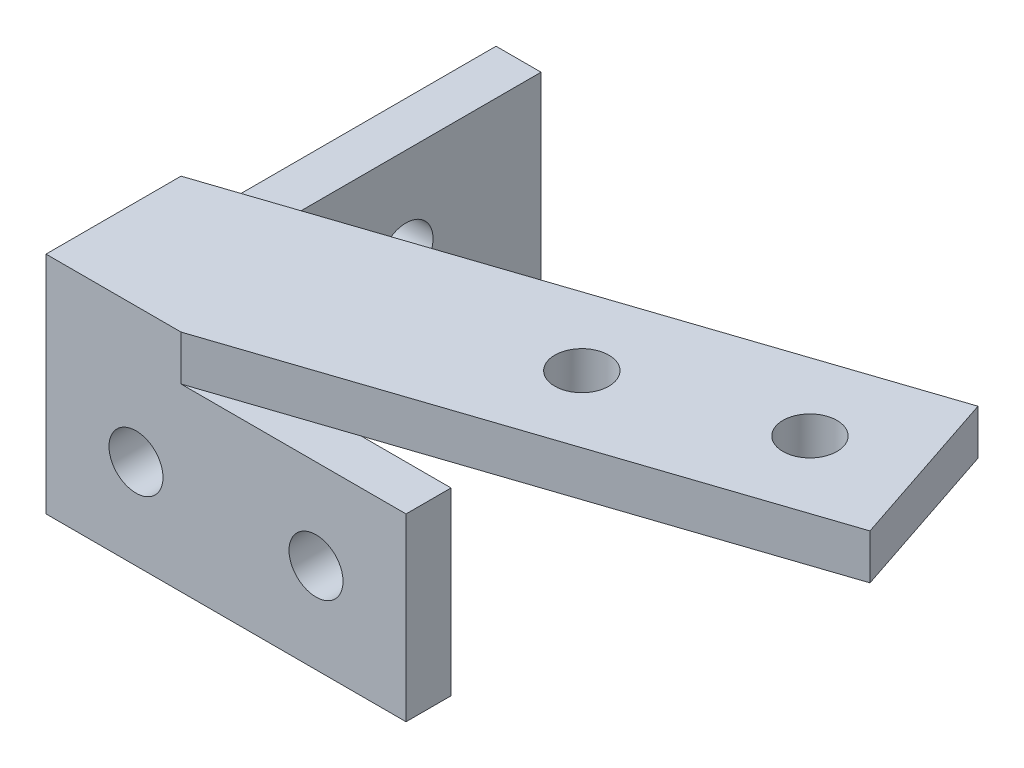
ISO-10303-21;
HEADER;
FILE_DESCRIPTION(('STEP AP214'),'2;1');
FILE_NAME('part.step','',(''),(''),'','','');
FILE_SCHEMA(('AUTOMOTIVE_DESIGN { 1 0 10303 214 1 1 1 1 }'));
ENDSEC;
DATA;
#1=APPLICATION_CONTEXT('core data for automotive mechanical design processes');
#2=APPLICATION_PROTOCOL_DEFINITION('international standard','automotive_design',2000,#1);
#3=PRODUCT_CONTEXT('',#1,'mechanical');
#4=PRODUCT('Part','Part','',(#3));
#5=PRODUCT_RELATED_PRODUCT_CATEGORY('part','',(#4));
#6=PRODUCT_DEFINITION_FORMATION('','',#4);
#7=PRODUCT_DEFINITION_CONTEXT('part definition',#1,'design');
#8=PRODUCT_DEFINITION('design','',#6,#7);
#9=PRODUCT_DEFINITION_SHAPE('','',#8);
#10=(LENGTH_UNIT() NAMED_UNIT(*) SI_UNIT(.MILLI.,.METRE.));
#11=(NAMED_UNIT(*) PLANE_ANGLE_UNIT() SI_UNIT($,.RADIAN.));
#12=(NAMED_UNIT(*) SI_UNIT($,.STERADIAN.) SOLID_ANGLE_UNIT());
#13=UNCERTAINTY_MEASURE_WITH_UNIT(LENGTH_MEASURE(1.E-05),#10,'distance_accuracy_value','');
#14=(GEOMETRIC_REPRESENTATION_CONTEXT(3) GLOBAL_UNCERTAINTY_ASSIGNED_CONTEXT((#13)) GLOBAL_UNIT_ASSIGNED_CONTEXT((#10,
#11,#12)) REPRESENTATION_CONTEXT('',''));
#15=CARTESIAN_POINT('',(0.,0.,0.));
#16=DIRECTION('',(0.,0.,1.));
#17=DIRECTION('',(1.,0.,0.));
#18=AXIS2_PLACEMENT_3D('',#15,#16,#17);
#19=CARTESIAN_POINT('',(0.,20.,0.));
#20=DIRECTION('',(0.,1.,0.));
#21=DIRECTION('',(0.,0.,1.));
#22=AXIS2_PLACEMENT_3D('',#19,#20,#21);
#23=PLANE('',#22);
#24=DIRECTION('',(-0.948683298177027,0.,0.316227765637297));
#25=VECTOR('',#24,1.);
#26=CARTESIAN_POINT('',(0.,20.,-15.));
#27=LINE('',#26,#25);
#28=CARTESIAN_POINT('',(5.,20.,-16.6666666644441));
#29=VERTEX_POINT('',#28);
#30=CARTESIAN_POINT('',(0.,20.,-15.));
#31=VERTEX_POINT('',#30);
#32=EDGE_CURVE('E11',#29,#31,#27,.T.);
#33=ORIENTED_EDGE('',*,*,#32,.F.);
#34=DIRECTION('',(0.,0.,-1.));
#35=VECTOR('',#34,1.);
#36=CARTESIAN_POINT('',(5.,20.,-5.));
#37=LINE('',#36,#35);
#38=CARTESIAN_POINT('',(5.,20.,-50.));
#39=VERTEX_POINT('',#38);
#40=EDGE_CURVE('E165',#29,#39,#37,.T.);
#41=ORIENTED_EDGE('',*,*,#40,.T.);
#42=DIRECTION('',(-1.,0.,0.));
#43=VECTOR('',#42,1.);
#44=CARTESIAN_POINT('',(5.,20.,-50.));
#45=LINE('',#44,#43);
#46=CARTESIAN_POINT('',(0.,20.,-50.));
#47=VERTEX_POINT('',#46);
#48=EDGE_CURVE('E153',#39,#47,#45,.T.);
#49=ORIENTED_EDGE('',*,*,#48,.T.);
#50=DIRECTION('',(0.,0.,1.));
#51=VECTOR('',#50,1.);
#52=CARTESIAN_POINT('',(0.,20.,-50.));
#53=LINE('',#52,#51);
#54=EDGE_CURVE('E156',#47,#31,#53,.T.);
#55=ORIENTED_EDGE('',*,*,#54,.T.);
#56=EDGE_LOOP('',(#33,#41,#49,#55));
#57=FACE_BOUND('',#56,.T.);
#58=ADVANCED_FACE('F37',(#57),#23,.T.);
#59=CARTESIAN_POINT('',(5.,20.,-50.));
#60=DIRECTION('',(0.,0.,1.));
#61=DIRECTION('',(1.,0.,0.));
#62=AXIS2_PLACEMENT_3D('',#59,#60,#61);
#63=PLANE('',#62);
#64=DIRECTION('',(-1.,0.,0.));
#65=VECTOR('',#64,1.);
#66=CARTESIAN_POINT('',(5.,0.,-50.));
#67=LINE('',#66,#65);
#68=CARTESIAN_POINT('',(5.,0.,-50.));
#69=VERTEX_POINT('',#68);
#70=CARTESIAN_POINT('',(0.,0.,-50.));
#71=VERTEX_POINT('',#70);
#72=EDGE_CURVE('E144',#69,#71,#67,.T.);
#73=ORIENTED_EDGE('',*,*,#72,.T.);
#74=DIRECTION('',(0.,-1.,0.));
#75=VECTOR('',#74,1.);
#76=CARTESIAN_POINT('',(0.,20.,-50.));
#77=LINE('',#76,#75);
#78=EDGE_CURVE('E46',#47,#71,#77,.T.);
#79=ORIENTED_EDGE('',*,*,#78,.F.);
#80=ORIENTED_EDGE('',*,*,#48,.F.);
#81=DIRECTION('',(0.,-1.,0.));
#82=VECTOR('',#81,1.);
#83=CARTESIAN_POINT('',(5.,20.,-50.));
#84=LINE('',#83,#82);
#85=EDGE_CURVE('E168',#39,#69,#84,.T.);
#86=ORIENTED_EDGE('',*,*,#85,.T.);
#87=EDGE_LOOP('',(#73,#79,#80,#86));
#88=FACE_BOUND('',#87,.T.);
#89=ADVANCED_FACE('F39',(#88),#63,.F.);
#90=CARTESIAN_POINT('',(0.,20.,-50.));
#91=DIRECTION('',(1.,0.,0.));
#92=DIRECTION('',(0.,0.,-1.));
#93=AXIS2_PLACEMENT_3D('',#90,#91,#92);
#94=PLANE('',#93);
#95=CARTESIAN_POINT('',(0.,10.,-15.));
#96=DIRECTION('',(1.,0.,0.));
#97=DIRECTION('',(0.,0.,-1.));
#98=AXIS2_PLACEMENT_3D('',#95,#96,#97);
#99=CIRCLE('',#98,3.);
#100=CARTESIAN_POINT('',(0.,10.,-18.));
#101=VERTEX_POINT('',#100);
#102=EDGE_CURVE('E207',#101,#101,#99,.T.);
#103=ORIENTED_EDGE('',*,*,#102,.T.);
#104=EDGE_LOOP('',(#103));
#105=FACE_BOUND('',#104,.T.);
#106=CARTESIAN_POINT('',(0.,10.,-35.));
#107=DIRECTION('',(1.,0.,0.));
#108=DIRECTION('',(0.,0.,-1.));
#109=AXIS2_PLACEMENT_3D('',#106,#107,#108);
#110=CIRCLE('',#109,2.99999999999999);
#111=CARTESIAN_POINT('',(0.,10.,-38.));
#112=VERTEX_POINT('',#111);
#113=EDGE_CURVE('E198',#112,#112,#110,.T.);
#114=ORIENTED_EDGE('',*,*,#113,.T.);
#115=EDGE_LOOP('',(#114));
#116=FACE_BOUND('',#115,.T.);
#117=DIRECTION('',(0.,0.,1.));
#118=VECTOR('',#117,1.);
#119=CARTESIAN_POINT('',(0.,0.,-50.));
#120=LINE('',#119,#118);
#121=CARTESIAN_POINT('',(0.,0.,0.));
#122=VERTEX_POINT('',#121);
#123=EDGE_CURVE('E147',#71,#122,#120,.T.);
#124=ORIENTED_EDGE('',*,*,#123,.T.);
#125=DIRECTION('',(0.,-1.,0.));
#126=VECTOR('',#125,1.);
#127=CARTESIAN_POINT('',(0.,20.,0.));
#128=LINE('',#127,#126);
#129=CARTESIAN_POINT('',(0.,25.,0.));
#130=VERTEX_POINT('',#129);
#131=EDGE_CURVE('E189',#130,#122,#128,.T.);
#132=ORIENTED_EDGE('',*,*,#131,.F.);
#133=DIRECTION('',(0.,0.,1.));
#134=VECTOR('',#133,1.);
#135=CARTESIAN_POINT('',(0.,25.,0.));
#136=LINE('',#135,#134);
#137=CARTESIAN_POINT('',(0.,25.,-15.));
#138=VERTEX_POINT('',#137);
#139=EDGE_CURVE('E137',#138,#130,#136,.T.);
#140=ORIENTED_EDGE('',*,*,#139,.F.);
#141=DIRECTION('',(0.,-1.,0.));
#142=VECTOR('',#141,1.);
#143=CARTESIAN_POINT('',(0.,25.,-15.));
#144=LINE('',#143,#142);
#145=EDGE_CURVE('E235',#138,#31,#144,.T.);
#146=ORIENTED_EDGE('',*,*,#145,.T.);
#147=ORIENTED_EDGE('',*,*,#54,.F.);
#148=ORIENTED_EDGE('',*,*,#78,.T.);
#149=EDGE_LOOP('',(#124,#132,#140,#146,#147,#148));
#150=FACE_BOUND('',#149,.T.);
#151=ADVANCED_FACE('F265',(#105,#116,#150),#94,.F.);
#152=CARTESIAN_POINT('',(0.,20.,0.));
#153=DIRECTION('',(0.,0.,-1.));
#154=DIRECTION('',(-1.,0.,0.));
#155=AXIS2_PLACEMENT_3D('',#152,#153,#154);
#156=PLANE('',#155);
#157=CARTESIAN_POINT('',(10.,10.,0.));
#158=DIRECTION('',(0.,0.,-1.));
#159=DIRECTION('',(-1.,0.,0.));
#160=AXIS2_PLACEMENT_3D('',#157,#158,#159);
#161=CIRCLE('',#160,3.);
#162=CARTESIAN_POINT('',(7.,10.,0.));
#163=VERTEX_POINT('',#162);
#164=EDGE_CURVE('E219',#163,#163,#161,.T.);
#165=ORIENTED_EDGE('',*,*,#164,.T.);
#166=EDGE_LOOP('',(#165));
#167=FACE_BOUND('',#166,.T.);
#168=CARTESIAN_POINT('',(30.,10.,0.));
#169=DIRECTION('',(0.,0.,-1.));
#170=DIRECTION('',(-1.,0.,0.));
#171=AXIS2_PLACEMENT_3D('',#168,#169,#170);
#172=CIRCLE('',#171,3.);
#173=CARTESIAN_POINT('',(27.,10.,0.));
#174=VERTEX_POINT('',#173);
#175=EDGE_CURVE('E210',#174,#174,#172,.T.);
#176=ORIENTED_EDGE('',*,*,#175,.T.);
#177=EDGE_LOOP('',(#176));
#178=FACE_BOUND('',#177,.T.);
#179=DIRECTION('',(1.,0.,0.));
#180=VECTOR('',#179,1.);
#181=CARTESIAN_POINT('',(0.,0.,0.));
#182=LINE('',#181,#180);
#183=CARTESIAN_POINT('',(40.,0.,0.));
#184=VERTEX_POINT('',#183);
#185=EDGE_CURVE('E171',#122,#184,#182,.T.);
#186=ORIENTED_EDGE('',*,*,#185,.T.);
#187=DIRECTION('',(0.,-1.,0.));
#188=VECTOR('',#187,1.);
#189=CARTESIAN_POINT('',(40.,20.,0.));
#190=LINE('',#189,#188);
#191=CARTESIAN_POINT('',(40.,20.,0.));
#192=VERTEX_POINT('',#191);
#193=EDGE_CURVE('E186',#192,#184,#190,.T.);
#194=ORIENTED_EDGE('',*,*,#193,.F.);
#195=DIRECTION('',(1.,0.,0.));
#196=VECTOR('',#195,1.);
#197=CARTESIAN_POINT('',(0.,20.,0.));
#198=LINE('',#197,#196);
#199=CARTESIAN_POINT('',(15.0000000000001,20.,0.));
#200=VERTEX_POINT('',#199);
#201=EDGE_CURVE('E143',#200,#192,#198,.T.);
#202=ORIENTED_EDGE('',*,*,#201,.F.);
#203=DIRECTION('',(0.,-1.,0.));
#204=VECTOR('',#203,1.);
#205=CARTESIAN_POINT('',(15.,25.,0.));
#206=LINE('',#205,#204);
#207=CARTESIAN_POINT('',(15.,25.,0.));
#208=VERTEX_POINT('',#207);
#209=EDGE_CURVE('E125',#208,#200,#206,.T.);
#210=ORIENTED_EDGE('',*,*,#209,.F.);
#211=DIRECTION('',(1.,0.,0.));
#212=VECTOR('',#211,1.);
#213=CARTESIAN_POINT('',(15.,25.,0.));
#214=LINE('',#213,#212);
#215=EDGE_CURVE('E131',#130,#208,#214,.T.);
#216=ORIENTED_EDGE('',*,*,#215,.F.);
#217=ORIENTED_EDGE('',*,*,#131,.T.);
#218=EDGE_LOOP('',(#186,#194,#202,#210,#216,#217));
#219=FACE_BOUND('',#218,.T.);
#220=ADVANCED_FACE('F141',(#167,#178,#219),#156,.F.);
#221=CARTESIAN_POINT('',(40.,20.,0.));
#222=DIRECTION('',(-1.,0.,0.));
#223=DIRECTION('',(0.,0.,1.));
#224=AXIS2_PLACEMENT_3D('',#221,#222,#223);
#225=PLANE('',#224);
#226=DIRECTION('',(0.,0.,-1.));
#227=VECTOR('',#226,1.);
#228=CARTESIAN_POINT('',(40.,0.,0.));
#229=LINE('',#228,#227);
#230=CARTESIAN_POINT('',(40.,0.,-5.));
#231=VERTEX_POINT('',#230);
#232=EDGE_CURVE('E173',#184,#231,#229,.T.);
#233=ORIENTED_EDGE('',*,*,#232,.T.);
#234=DIRECTION('',(0.,-1.,0.));
#235=VECTOR('',#234,1.);
#236=CARTESIAN_POINT('',(40.,20.,-5.));
#237=LINE('',#236,#235);
#238=CARTESIAN_POINT('',(40.,20.,-5.));
#239=VERTEX_POINT('',#238);
#240=EDGE_CURVE('E183',#239,#231,#237,.T.);
#241=ORIENTED_EDGE('',*,*,#240,.F.);
#242=DIRECTION('',(0.,0.,-1.));
#243=VECTOR('',#242,1.);
#244=CARTESIAN_POINT('',(40.,20.,0.));
#245=LINE('',#244,#243);
#246=EDGE_CURVE('E160',#192,#239,#245,.T.);
#247=ORIENTED_EDGE('',*,*,#246,.F.);
#248=ORIENTED_EDGE('',*,*,#193,.T.);
#249=EDGE_LOOP('',(#233,#241,#247,#248));
#250=FACE_BOUND('',#249,.T.);
#251=ADVANCED_FACE('F273',(#250),#225,.F.);
#252=CARTESIAN_POINT('',(40.,20.,-5.));
#253=DIRECTION('',(0.,0.,1.));
#254=DIRECTION('',(1.,0.,0.));
#255=AXIS2_PLACEMENT_3D('',#252,#253,#254);
#256=PLANE('',#255);
#257=CARTESIAN_POINT('',(10.,10.,-5.));
#258=DIRECTION('',(0.,0.,-1.));
#259=DIRECTION('',(-1.,0.,0.));
#260=AXIS2_PLACEMENT_3D('',#257,#258,#259);
#261=CIRCLE('',#260,3.);
#262=CARTESIAN_POINT('',(7.,10.,-5.));
#263=VERTEX_POINT('',#262);
#264=EDGE_CURVE('E223',#263,#263,#261,.T.);
#265=ORIENTED_EDGE('',*,*,#264,.F.);
#266=EDGE_LOOP('',(#265));
#267=FACE_BOUND('',#266,.T.);
#268=CARTESIAN_POINT('',(30.,10.,-5.));
#269=DIRECTION('',(0.,0.,-1.));
#270=DIRECTION('',(-1.,0.,0.));
#271=AXIS2_PLACEMENT_3D('',#268,#269,#270);
#272=CIRCLE('',#271,3.);
#273=CARTESIAN_POINT('',(27.,10.,-5.));
#274=VERTEX_POINT('',#273);
#275=EDGE_CURVE('E226',#274,#274,#272,.T.);
#276=ORIENTED_EDGE('',*,*,#275,.F.);
#277=EDGE_LOOP('',(#276));
#278=FACE_BOUND('',#277,.T.);
#279=DIRECTION('',(-1.,0.,0.));
#280=VECTOR('',#279,1.);
#281=CARTESIAN_POINT('',(40.,0.,-5.));
#282=LINE('',#281,#280);
#283=CARTESIAN_POINT('',(5.,0.,-5.));
#284=VERTEX_POINT('',#283);
#285=EDGE_CURVE('E175',#231,#284,#282,.T.);
#286=ORIENTED_EDGE('',*,*,#285,.T.);
#287=DIRECTION('',(0.,-1.,0.));
#288=VECTOR('',#287,1.);
#289=CARTESIAN_POINT('',(5.,20.,-5.));
#290=LINE('',#289,#288);
#291=CARTESIAN_POINT('',(5.,20.,-5.));
#292=VERTEX_POINT('',#291);
#293=EDGE_CURVE('E180',#292,#284,#290,.T.);
#294=ORIENTED_EDGE('',*,*,#293,.F.);
#295=DIRECTION('',(-1.,0.,0.));
#296=VECTOR('',#295,1.);
#297=CARTESIAN_POINT('',(40.,20.,-5.));
#298=LINE('',#297,#296);
#299=CARTESIAN_POINT('',(30.0000000200036,20.,-5.00000000000001));
#300=VERTEX_POINT('',#299);
#301=EDGE_CURVE('E162',#300,#292,#298,.T.);
#302=ORIENTED_EDGE('',*,*,#301,.F.);
#303=EDGE_CURVE('E163',#239,#300,#298,.T.);
#304=ORIENTED_EDGE('',*,*,#303,.F.);
#305=ORIENTED_EDGE('',*,*,#240,.T.);
#306=EDGE_LOOP('',(#286,#294,#302,#304,#305));
#307=FACE_BOUND('',#306,.T.);
#308=ADVANCED_FACE('F277',(#267,#278,#307),#256,.F.);
#309=CARTESIAN_POINT('',(5.,20.,-5.));
#310=DIRECTION('',(-1.,0.,0.));
#311=DIRECTION('',(0.,0.,1.));
#312=AXIS2_PLACEMENT_3D('',#309,#310,#311);
#313=PLANE('',#312);
#314=CARTESIAN_POINT('',(5.,10.,-15.));
#315=DIRECTION('',(1.,0.,0.));
#316=DIRECTION('',(0.,0.,-1.));
#317=AXIS2_PLACEMENT_3D('',#314,#315,#316);
#318=CIRCLE('',#317,3.);
#319=CARTESIAN_POINT('',(5.,10.,-18.));
#320=VERTEX_POINT('',#319);
#321=EDGE_CURVE('E211',#320,#320,#318,.T.);
#322=ORIENTED_EDGE('',*,*,#321,.F.);
#323=EDGE_LOOP('',(#322));
#324=FACE_BOUND('',#323,.T.);
#325=CARTESIAN_POINT('',(5.,10.,-35.));
#326=DIRECTION('',(1.,0.,0.));
#327=DIRECTION('',(0.,0.,-1.));
#328=AXIS2_PLACEMENT_3D('',#325,#326,#327);
#329=CIRCLE('',#328,2.99999999999999);
#330=CARTESIAN_POINT('',(5.,10.,-38.));
#331=VERTEX_POINT('',#330);
#332=EDGE_CURVE('E214',#331,#331,#329,.T.);
#333=ORIENTED_EDGE('',*,*,#332,.F.);
#334=EDGE_LOOP('',(#333));
#335=FACE_BOUND('',#334,.T.);
#336=DIRECTION('',(0.,0.,-1.));
#337=VECTOR('',#336,1.);
#338=CARTESIAN_POINT('',(5.,0.,-5.));
#339=LINE('',#338,#337);
#340=EDGE_CURVE('E157',#284,#69,#339,.T.);
#341=ORIENTED_EDGE('',*,*,#340,.T.);
#342=ORIENTED_EDGE('',*,*,#85,.F.);
#343=ORIENTED_EDGE('',*,*,#40,.F.);
#344=EDGE_CURVE('E166',#292,#29,#37,.T.);
#345=ORIENTED_EDGE('',*,*,#344,.F.);
#346=ORIENTED_EDGE('',*,*,#293,.T.);
#347=EDGE_LOOP('',(#341,#342,#343,#345,#346));
#348=FACE_BOUND('',#347,.T.);
#349=ADVANCED_FACE('F257',(#324,#335,#348),#313,.F.);
#350=DIRECTION('',(0.948683298177027,0.,-0.316227765637297));
#351=VECTOR('',#350,1.);
#352=CARTESIAN_POINT('',(72.4078308639904,20.,-19.135943595811));
#353=LINE('',#352,#351);
#354=EDGE_CURVE('E61',#200,#300,#353,.T.);
#355=ORIENTED_EDGE('',*,*,#354,.F.);
#356=ORIENTED_EDGE('',*,*,#201,.T.);
#357=ORIENTED_EDGE('',*,*,#246,.T.);
#358=ORIENTED_EDGE('',*,*,#303,.T.);
#359=EDGE_LOOP('',(#355,#356,#357,#358));
#360=FACE_BOUND('',#359,.T.);
#361=ADVANCED_FACE('F278',(#360),#23,.T.);
#362=CARTESIAN_POINT('',(0.,0.,0.));
#363=DIRECTION('',(0.,1.,0.));
#364=DIRECTION('',(0.,0.,1.));
#365=AXIS2_PLACEMENT_3D('',#362,#363,#364);
#366=PLANE('',#365);
#367=ORIENTED_EDGE('',*,*,#72,.F.);
#368=ORIENTED_EDGE('',*,*,#340,.F.);
#369=ORIENTED_EDGE('',*,*,#285,.F.);
#370=ORIENTED_EDGE('',*,*,#232,.F.);
#371=ORIENTED_EDGE('',*,*,#185,.F.);
#372=ORIENTED_EDGE('',*,*,#123,.F.);
#373=EDGE_LOOP('',(#367,#368,#369,#370,#371,#372));
#374=FACE_BOUND('',#373,.T.);
#375=ADVANCED_FACE('F269',(#374),#366,.F.);
#376=CARTESIAN_POINT('',(72.4078308639904,25.,-19.135943595811));
#377=DIRECTION('',(-0.316227765637297,0.,-0.948683298177027));
#378=DIRECTION('',(-0.948683298177028,0.,0.316227765637297));
#379=AXIS2_PLACEMENT_3D('',#376,#377,#378);
#380=PLANE('',#379);
#381=ORIENTED_EDGE('',*,*,#354,.T.);
#382=CARTESIAN_POINT('',(72.4078308639904,20.,-19.135943595811));
#383=VERTEX_POINT('',#382);
#384=EDGE_CURVE('E222',#300,#383,#353,.T.);
#385=ORIENTED_EDGE('',*,*,#384,.T.);
#386=DIRECTION('',(0.,-1.,0.));
#387=VECTOR('',#386,1.);
#388=CARTESIAN_POINT('',(72.4078308639904,25.,-19.135943595811));
#389=LINE('',#388,#387);
#390=CARTESIAN_POINT('',(72.4078308639904,25.,-19.135943595811));
#391=VERTEX_POINT('',#390);
#392=EDGE_CURVE('E127',#391,#383,#389,.T.);
#393=ORIENTED_EDGE('',*,*,#392,.F.);
#394=DIRECTION('',(0.948683298177027,0.,-0.316227765637297));
#395=VECTOR('',#394,1.);
#396=CARTESIAN_POINT('',(72.4078308639904,25.,-19.135943595811));
#397=LINE('',#396,#395);
#398=EDGE_CURVE('E121',#208,#391,#397,.T.);
#399=ORIENTED_EDGE('',*,*,#398,.F.);
#400=ORIENTED_EDGE('',*,*,#209,.T.);
#401=EDGE_LOOP('',(#381,#385,#393,#399,#400));
#402=FACE_BOUND('',#401,.T.);
#403=ADVANCED_FACE('F123',(#402),#380,.F.);
#404=CARTESIAN_POINT('',(66.4078308723919,25.,-37.1359435946108));
#405=DIRECTION('',(-0.948683298177028,0.,0.316227765637297));
#406=DIRECTION('',(0.316227765637297,0.,0.948683298177028));
#407=AXIS2_PLACEMENT_3D('',#404,#405,#406);
#408=PLANE('',#407);
#409=DIRECTION('',(-0.316227765637297,0.,-0.948683298177028));
#410=VECTOR('',#409,1.);
#411=CARTESIAN_POINT('',(66.4078308723919,20.,-37.1359435946108));
#412=LINE('',#411,#410);
#413=CARTESIAN_POINT('',(66.4078308723919,20.,-37.1359435946108));
#414=VERTEX_POINT('',#413);
#415=EDGE_CURVE('E237',#383,#414,#412,.T.);
#416=ORIENTED_EDGE('',*,*,#415,.T.);
#417=DIRECTION('',(0.,-1.,0.));
#418=VECTOR('',#417,1.);
#419=CARTESIAN_POINT('',(66.4078308723919,25.,-37.1359435946108));
#420=LINE('',#419,#418);
#421=CARTESIAN_POINT('',(66.4078308723919,25.,-37.1359435946108));
#422=VERTEX_POINT('',#421);
#423=EDGE_CURVE('E149',#422,#414,#420,.T.);
#424=ORIENTED_EDGE('',*,*,#423,.F.);
#425=DIRECTION('',(-0.316227765637297,0.,-0.948683298177028));
#426=VECTOR('',#425,1.);
#427=CARTESIAN_POINT('',(66.4078308723919,25.,-37.1359435946108));
#428=LINE('',#427,#426);
#429=EDGE_CURVE('E130',#391,#422,#428,.T.);
#430=ORIENTED_EDGE('',*,*,#429,.F.);
#431=ORIENTED_EDGE('',*,*,#392,.T.);
#432=EDGE_LOOP('',(#416,#424,#430,#431));
#433=FACE_BOUND('',#432,.T.);
#434=ADVANCED_FACE('F336',(#433),#408,.F.);
#435=CARTESIAN_POINT('',(0.,25.,-15.));
#436=DIRECTION('',(0.316227765637298,0.,0.948683298177027));
#437=DIRECTION('',(0.948683298177027,0.,-0.316227765637298));
#438=AXIS2_PLACEMENT_3D('',#435,#436,#437);
#439=PLANE('',#438);
#440=EDGE_CURVE('E48',#414,#29,#27,.T.);
#441=ORIENTED_EDGE('',*,*,#440,.T.);
#442=ORIENTED_EDGE('',*,*,#32,.T.);
#443=ORIENTED_EDGE('',*,*,#145,.F.);
#444=DIRECTION('',(-0.948683298177027,0.,0.316227765637297));
#445=VECTOR('',#444,1.);
#446=CARTESIAN_POINT('',(0.,25.,-15.));
#447=LINE('',#446,#445);
#448=EDGE_CURVE('E232',#422,#138,#447,.T.);
#449=ORIENTED_EDGE('',*,*,#448,.F.);
#450=ORIENTED_EDGE('',*,*,#423,.T.);
#451=EDGE_LOOP('',(#441,#442,#443,#449,#450));
#452=FACE_BOUND('',#451,.T.);
#453=ADVANCED_FACE('F246',(#452),#439,.F.);
#454=CARTESIAN_POINT('',(0.,25.,0.));
#455=DIRECTION('',(0.,-1.,0.));
#456=DIRECTION('',(0.,0.,-1.));
#457=AXIS2_PLACEMENT_3D('',#454,#455,#456);
#458=PLANE('',#457);
#459=CARTESIAN_POINT('',(59.9323744322065,25.,-24.9395363014358));
#460=DIRECTION('',(0.,1.,0.));
#461=DIRECTION('',(0.,0.,1.));
#462=AXIS2_PLACEMENT_3D('',#459,#460,#461);
#463=CIRCLE('',#462,3.00000000000001);
#464=CARTESIAN_POINT('',(59.9323744322065,25.,-21.9395363014358));
#465=VERTEX_POINT('',#464);
#466=EDGE_CURVE('E194',#465,#465,#463,.T.);
#467=ORIENTED_EDGE('',*,*,#466,.F.);
#468=EDGE_LOOP('',(#467));
#469=FACE_BOUND('',#468,.T.);
#470=CARTESIAN_POINT('',(40.9815841958942,25.,-18.5467630832392));
#471=DIRECTION('',(0.,1.,0.));
#472=DIRECTION('',(0.,0.,1.));
#473=AXIS2_PLACEMENT_3D('',#470,#471,#472);
#474=CIRCLE('',#473,3.);
#475=CARTESIAN_POINT('',(40.9815841958942,25.,-15.5467630832392));
#476=VERTEX_POINT('',#475);
#477=EDGE_CURVE('E200',#476,#476,#474,.T.);
#478=ORIENTED_EDGE('',*,*,#477,.F.);
#479=EDGE_LOOP('',(#478));
#480=FACE_BOUND('',#479,.T.);
#481=ORIENTED_EDGE('',*,*,#215,.T.);
#482=ORIENTED_EDGE('',*,*,#398,.T.);
#483=ORIENTED_EDGE('',*,*,#429,.T.);
#484=ORIENTED_EDGE('',*,*,#448,.T.);
#485=ORIENTED_EDGE('',*,*,#139,.T.);
#486=EDGE_LOOP('',(#481,#482,#483,#484,#485));
#487=FACE_BOUND('',#486,.T.);
#488=ADVANCED_FACE('F135',(#469,#480,#487),#458,.F.);
#489=CARTESIAN_POINT('',(0.,20.,0.));
#490=DIRECTION('',(0.,-1.,0.));
#491=DIRECTION('',(0.,0.,-1.));
#492=AXIS2_PLACEMENT_3D('',#489,#490,#491);
#493=PLANE('',#492);
#494=CARTESIAN_POINT('',(59.9323744322065,20.,-24.9395363014358));
#495=DIRECTION('',(0.,-1.,0.));
#496=DIRECTION('',(0.,0.,-1.));
#497=AXIS2_PLACEMENT_3D('',#494,#495,#496);
#498=CIRCLE('',#497,3.00000000000001);
#499=CARTESIAN_POINT('',(59.9323744322065,20.,-27.9395363014358));
#500=VERTEX_POINT('',#499);
#501=EDGE_CURVE('E41',#500,#500,#498,.T.);
#502=ORIENTED_EDGE('',*,*,#501,.F.);
#503=EDGE_LOOP('',(#502));
#504=FACE_BOUND('',#503,.T.);
#505=CARTESIAN_POINT('',(40.9815841958942,20.,-18.5467630832392));
#506=DIRECTION('',(0.,-1.,0.));
#507=DIRECTION('',(0.,0.,-1.));
#508=AXIS2_PLACEMENT_3D('',#505,#506,#507);
#509=CIRCLE('',#508,3.);
#510=CARTESIAN_POINT('',(40.9815841958942,20.,-21.5467630832392));
#511=VERTEX_POINT('',#510);
#512=EDGE_CURVE('E192',#511,#511,#509,.T.);
#513=ORIENTED_EDGE('',*,*,#512,.F.);
#514=EDGE_LOOP('',(#513));
#515=FACE_BOUND('',#514,.T.);
#516=ORIENTED_EDGE('',*,*,#384,.F.);
#517=ORIENTED_EDGE('',*,*,#301,.T.);
#518=ORIENTED_EDGE('',*,*,#344,.T.);
#519=ORIENTED_EDGE('',*,*,#440,.F.);
#520=ORIENTED_EDGE('',*,*,#415,.F.);
#521=EDGE_LOOP('',(#516,#517,#518,#519,#520));
#522=FACE_BOUND('',#521,.T.);
#523=ADVANCED_FACE('F252',(#504,#515,#522),#493,.T.);
#524=CARTESIAN_POINT('',(30.,10.,0.));
#525=DIRECTION('',(0.,0.,-1.));
#526=DIRECTION('',(-1.,0.,0.));
#527=AXIS2_PLACEMENT_3D('',#524,#525,#526);
#528=CYLINDRICAL_SURFACE('',#527,3.);
#529=ORIENTED_EDGE('',*,*,#175,.F.);
#530=EDGE_LOOP('',(#529));
#531=FACE_BOUND('',#530,.T.);
#532=ORIENTED_EDGE('',*,*,#275,.T.);
#533=EDGE_LOOP('',(#532));
#534=FACE_BOUND('',#533,.T.);
#535=ADVANCED_FACE('F314',(#531,#534),#528,.F.);
#536=CARTESIAN_POINT('',(10.,10.,0.));
#537=DIRECTION('',(0.,0.,-1.));
#538=DIRECTION('',(-1.,0.,0.));
#539=AXIS2_PLACEMENT_3D('',#536,#537,#538);
#540=CYLINDRICAL_SURFACE('',#539,3.);
#541=ORIENTED_EDGE('',*,*,#164,.F.);
#542=EDGE_LOOP('',(#541));
#543=FACE_BOUND('',#542,.T.);
#544=ORIENTED_EDGE('',*,*,#264,.T.);
#545=EDGE_LOOP('',(#544));
#546=FACE_BOUND('',#545,.T.);
#547=ADVANCED_FACE('F316',(#543,#546),#540,.F.);
#548=CARTESIAN_POINT('',(0.,10.,-35.));
#549=DIRECTION('',(1.,0.,0.));
#550=DIRECTION('',(0.,0.,-1.));
#551=AXIS2_PLACEMENT_3D('',#548,#549,#550);
#552=CYLINDRICAL_SURFACE('',#551,2.99999999999999);
#553=ORIENTED_EDGE('',*,*,#113,.F.);
#554=EDGE_LOOP('',(#553));
#555=FACE_BOUND('',#554,.T.);
#556=ORIENTED_EDGE('',*,*,#332,.T.);
#557=EDGE_LOOP('',(#556));
#558=FACE_BOUND('',#557,.T.);
#559=ADVANCED_FACE('F323',(#555,#558),#552,.F.);
#560=CARTESIAN_POINT('',(0.,10.,-15.));
#561=DIRECTION('',(1.,0.,0.));
#562=DIRECTION('',(0.,0.,-1.));
#563=AXIS2_PLACEMENT_3D('',#560,#561,#562);
#564=CYLINDRICAL_SURFACE('',#563,3.);
#565=ORIENTED_EDGE('',*,*,#102,.F.);
#566=EDGE_LOOP('',(#565));
#567=FACE_BOUND('',#566,.T.);
#568=ORIENTED_EDGE('',*,*,#321,.T.);
#569=EDGE_LOOP('',(#568));
#570=FACE_BOUND('',#569,.T.);
#571=ADVANCED_FACE('F374',(#567,#570),#564,.F.);
#572=CARTESIAN_POINT('',(40.9815841958942,0.,-18.5467630832392));
#573=DIRECTION('',(0.,1.,0.));
#574=DIRECTION('',(0.,0.,1.));
#575=AXIS2_PLACEMENT_3D('',#572,#573,#574);
#576=CYLINDRICAL_SURFACE('',#575,3.);
#577=ORIENTED_EDGE('',*,*,#512,.T.);
#578=EDGE_LOOP('',(#577));
#579=FACE_BOUND('',#578,.T.);
#580=ORIENTED_EDGE('',*,*,#477,.T.);
#581=EDGE_LOOP('',(#580));
#582=FACE_BOUND('',#581,.T.);
#583=ADVANCED_FACE('F368',(#579,#582),#576,.F.);
#584=CARTESIAN_POINT('',(59.9323744322065,0.,-24.9395363014358));
#585=DIRECTION('',(0.,1.,0.));
#586=DIRECTION('',(0.,0.,1.));
#587=AXIS2_PLACEMENT_3D('',#584,#585,#586);
#588=CYLINDRICAL_SURFACE('',#587,3.00000000000001);
#589=ORIENTED_EDGE('',*,*,#501,.T.);
#590=EDGE_LOOP('',(#589));
#591=FACE_BOUND('',#590,.T.);
#592=ORIENTED_EDGE('',*,*,#466,.T.);
#593=EDGE_LOOP('',(#592));
#594=FACE_BOUND('',#593,.T.);
#595=ADVANCED_FACE('F373',(#591,#594),#588,.F.);
#596=CLOSED_SHELL('',(#58,#89,#151,#220,#251,#308,#349,#361,#375,#403,#434,#453,#488,#523,#535,
#547,#559,#571,#583,#595));
#597=MANIFOLD_SOLID_BREP('B2',#596);
#598=ADVANCED_BREP_SHAPE_REPRESENTATION('',(#18,#597),#14);
#599=SHAPE_DEFINITION_REPRESENTATION(#9,#598);
ENDSEC;
END-ISO-10303-21;
